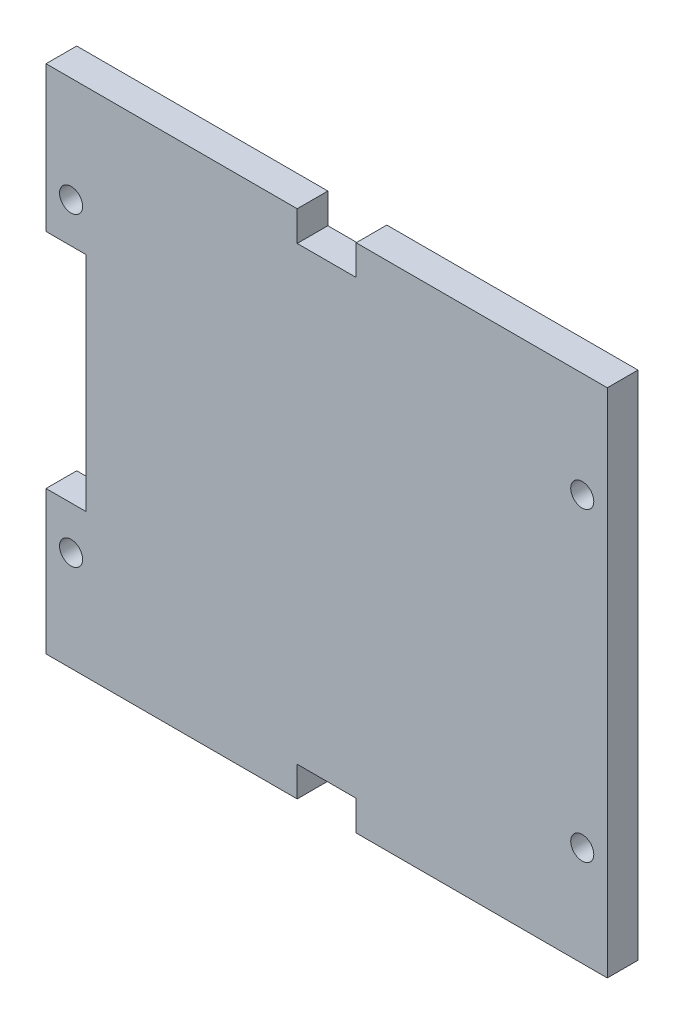
ISO-10303-21;
HEADER;
FILE_DESCRIPTION(('STEP AP214'),'2;1');
FILE_NAME('part.step','',(''),(''),'','','');
FILE_SCHEMA(('AUTOMOTIVE_DESIGN { 1 0 10303 214 1 1 1 1 }'));
ENDSEC;
DATA;
#1=APPLICATION_CONTEXT('core data for automotive mechanical design processes');
#2=APPLICATION_PROTOCOL_DEFINITION('international standard','automotive_design',2000,#1);
#3=PRODUCT_CONTEXT('',#1,'mechanical');
#4=PRODUCT('Part','Part','',(#3));
#5=PRODUCT_RELATED_PRODUCT_CATEGORY('part','',(#4));
#6=PRODUCT_DEFINITION_FORMATION('','',#4);
#7=PRODUCT_DEFINITION_CONTEXT('part definition',#1,'design');
#8=PRODUCT_DEFINITION('design','',#6,#7);
#9=PRODUCT_DEFINITION_SHAPE('','',#8);
#10=(LENGTH_UNIT() NAMED_UNIT(*) SI_UNIT(.MILLI.,.METRE.));
#11=(NAMED_UNIT(*) PLANE_ANGLE_UNIT() SI_UNIT($,.RADIAN.));
#12=(NAMED_UNIT(*) SI_UNIT($,.STERADIAN.) SOLID_ANGLE_UNIT());
#13=UNCERTAINTY_MEASURE_WITH_UNIT(LENGTH_MEASURE(1.E-05),#10,'distance_accuracy_value','');
#14=(GEOMETRIC_REPRESENTATION_CONTEXT(3) GLOBAL_UNCERTAINTY_ASSIGNED_CONTEXT((#13)) GLOBAL_UNIT_ASSIGNED_CONTEXT((#10,
#11,#12)) REPRESENTATION_CONTEXT('',''));
#15=CARTESIAN_POINT('',(0.,0.,0.));
#16=DIRECTION('',(0.,0.,1.));
#17=DIRECTION('',(1.,0.,0.));
#18=AXIS2_PLACEMENT_3D('',#15,#16,#17);
#19=CARTESIAN_POINT('',(0.,45.,3.06));
#20=DIRECTION('',(-1.,0.,0.));
#21=DIRECTION('',(0.,0.,1.));
#22=AXIS2_PLACEMENT_3D('',#19,#20,#21);
#23=PLANE('',#22);
#24=DIRECTION('',(0.,0.,1.));
#25=VECTOR('',#24,1.);
#26=CARTESIAN_POINT('',(0.,33.5,0.));
#27=LINE('',#26,#25);
#28=CARTESIAN_POINT('',(0.,33.5,0.));
#29=VERTEX_POINT('',#28);
#30=CARTESIAN_POINT('',(0.,33.5,3.06));
#31=VERTEX_POINT('',#30);
#32=EDGE_CURVE('E191',#29,#31,#27,.T.);
#33=ORIENTED_EDGE('',*,*,#32,.T.);
#34=DIRECTION('',(0.,-1.,0.));
#35=VECTOR('',#34,1.);
#36=CARTESIAN_POINT('',(0.,0.,3.06));
#37=LINE('',#36,#35);
#38=CARTESIAN_POINT('',(0.,48.,3.06));
#39=VERTEX_POINT('',#38);
#40=EDGE_CURVE('E276',#39,#31,#37,.T.);
#41=ORIENTED_EDGE('',*,*,#40,.F.);
#42=DIRECTION('',(0.,0.,-1.));
#43=VECTOR('',#42,1.);
#44=CARTESIAN_POINT('',(0.,48.,3.06));
#45=LINE('',#44,#43);
#46=CARTESIAN_POINT('',(0.,48.,0.));
#47=VERTEX_POINT('',#46);
#48=EDGE_CURVE('E253',#39,#47,#45,.T.);
#49=ORIENTED_EDGE('',*,*,#48,.T.);
#50=DIRECTION('',(0.,1.,0.));
#51=VECTOR('',#50,1.);
#52=CARTESIAN_POINT('',(0.,45.,0.));
#53=LINE('',#52,#51);
#54=EDGE_CURVE('E195',#29,#47,#53,.T.);
#55=ORIENTED_EDGE('',*,*,#54,.F.);
#56=EDGE_LOOP('',(#33,#41,#49,#55));
#57=FACE_BOUND('',#56,.T.);
#58=ADVANCED_FACE('F45',(#57),#23,.T.);
#59=CARTESIAN_POINT('',(25.06,0.,3.06));
#60=DIRECTION('',(1.,0.,0.));
#61=DIRECTION('',(0.,0.,-1.));
#62=AXIS2_PLACEMENT_3D('',#59,#60,#61);
#63=PLANE('',#62);
#64=DIRECTION('',(0.,-1.,0.));
#65=VECTOR('',#64,1.);
#66=CARTESIAN_POINT('',(25.06,0.,0.));
#67=LINE('',#66,#65);
#68=CARTESIAN_POINT('',(25.06,0.,0.));
#69=VERTEX_POINT('',#68);
#70=CARTESIAN_POINT('',(25.06,-3.,0.));
#71=VERTEX_POINT('',#70);
#72=EDGE_CURVE('E186',#69,#71,#67,.T.);
#73=ORIENTED_EDGE('',*,*,#72,.F.);
#74=DIRECTION('',(0.,0.,-1.));
#75=VECTOR('',#74,1.);
#76=CARTESIAN_POINT('',(25.06,0.,3.06));
#77=LINE('',#76,#75);
#78=CARTESIAN_POINT('',(25.06,0.,3.06));
#79=VERTEX_POINT('',#78);
#80=EDGE_CURVE('E11',#79,#69,#77,.T.);
#81=ORIENTED_EDGE('',*,*,#80,.F.);
#82=DIRECTION('',(0.,-1.,0.));
#83=VECTOR('',#82,1.);
#84=CARTESIAN_POINT('',(25.06,0.,3.06));
#85=LINE('',#84,#83);
#86=CARTESIAN_POINT('',(25.06,-3.,3.06));
#87=VERTEX_POINT('',#86);
#88=EDGE_CURVE('E231',#79,#87,#85,.T.);
#89=ORIENTED_EDGE('',*,*,#88,.T.);
#90=DIRECTION('',(0.,0.,-1.));
#91=VECTOR('',#90,1.);
#92=CARTESIAN_POINT('',(25.06,-3.,3.06));
#93=LINE('',#92,#91);
#94=EDGE_CURVE('E49',#87,#71,#93,.T.);
#95=ORIENTED_EDGE('',*,*,#94,.T.);
#96=EDGE_LOOP('',(#73,#81,#89,#95));
#97=FACE_BOUND('',#96,.T.);
#98=ADVANCED_FACE('F47',(#97),#63,.T.);
#99=CARTESIAN_POINT('',(25.06,0.,3.06));
#100=DIRECTION('',(0.,1.,0.));
#101=DIRECTION('',(-1.,0.,0.));
#102=AXIS2_PLACEMENT_3D('',#99,#100,#101);
#103=PLANE('',#102);
#104=DIRECTION('',(1.,0.,0.));
#105=VECTOR('',#104,1.);
#106=CARTESIAN_POINT('',(25.06,0.,0.));
#107=LINE('',#106,#105);
#108=CARTESIAN_POINT('',(30.94,0.,0.));
#109=VERTEX_POINT('',#108);
#110=EDGE_CURVE('E229',#69,#109,#107,.T.);
#111=ORIENTED_EDGE('',*,*,#110,.T.);
#112=DIRECTION('',(0.,0.,-1.));
#113=VECTOR('',#112,1.);
#114=CARTESIAN_POINT('',(30.94,0.,3.06));
#115=LINE('',#114,#113);
#116=CARTESIAN_POINT('',(30.94,0.,3.06));
#117=VERTEX_POINT('',#116);
#118=EDGE_CURVE('E55',#117,#109,#115,.T.);
#119=ORIENTED_EDGE('',*,*,#118,.F.);
#120=DIRECTION('',(1.,0.,0.));
#121=VECTOR('',#120,1.);
#122=CARTESIAN_POINT('',(25.06,0.,3.06));
#123=LINE('',#122,#121);
#124=EDGE_CURVE('E157',#79,#117,#123,.T.);
#125=ORIENTED_EDGE('',*,*,#124,.F.);
#126=ORIENTED_EDGE('',*,*,#80,.T.);
#127=EDGE_LOOP('',(#111,#119,#125,#126));
#128=FACE_BOUND('',#127,.T.);
#129=ADVANCED_FACE('F266',(#128),#103,.F.);
#130=CARTESIAN_POINT('',(30.94,0.,3.06));
#131=DIRECTION('',(1.,0.,0.));
#132=DIRECTION('',(0.,0.,-1.));
#133=AXIS2_PLACEMENT_3D('',#130,#131,#132);
#134=PLANE('',#133);
#135=DIRECTION('',(0.,-1.,0.));
#136=VECTOR('',#135,1.);
#137=CARTESIAN_POINT('',(30.94,0.,0.));
#138=LINE('',#137,#136);
#139=CARTESIAN_POINT('',(30.94,-3.,0.));
#140=VERTEX_POINT('',#139);
#141=EDGE_CURVE('E167',#109,#140,#138,.T.);
#142=ORIENTED_EDGE('',*,*,#141,.T.);
#143=DIRECTION('',(0.,0.,-1.));
#144=VECTOR('',#143,1.);
#145=CARTESIAN_POINT('',(30.94,-3.,3.06));
#146=LINE('',#145,#144);
#147=CARTESIAN_POINT('',(30.94,-3.,3.06));
#148=VERTEX_POINT('',#147);
#149=EDGE_CURVE('E164',#148,#140,#146,.T.);
#150=ORIENTED_EDGE('',*,*,#149,.F.);
#151=DIRECTION('',(0.,-1.,0.));
#152=VECTOR('',#151,1.);
#153=CARTESIAN_POINT('',(30.94,0.,3.06));
#154=LINE('',#153,#152);
#155=EDGE_CURVE('E151',#117,#148,#154,.T.);
#156=ORIENTED_EDGE('',*,*,#155,.F.);
#157=ORIENTED_EDGE('',*,*,#118,.T.);
#158=EDGE_LOOP('',(#142,#150,#156,#157));
#159=FACE_BOUND('',#158,.T.);
#160=ADVANCED_FACE('F165',(#159),#134,.F.);
#161=CARTESIAN_POINT('',(56.,-3.,3.06));
#162=DIRECTION('',(0.,-1.,0.));
#163=DIRECTION('',(1.,0.,0.));
#164=AXIS2_PLACEMENT_3D('',#161,#162,#163);
#165=PLANE('',#164);
#166=DIRECTION('',(-1.,0.,0.));
#167=VECTOR('',#166,1.);
#168=CARTESIAN_POINT('',(56.,-3.,0.));
#169=LINE('',#168,#167);
#170=CARTESIAN_POINT('',(56.,-3.,0.));
#171=VERTEX_POINT('',#170);
#172=EDGE_CURVE('E224',#171,#140,#169,.T.);
#173=ORIENTED_EDGE('',*,*,#172,.F.);
#174=DIRECTION('',(0.,0.,-1.));
#175=VECTOR('',#174,1.);
#176=CARTESIAN_POINT('',(56.,-3.,3.06));
#177=LINE('',#176,#175);
#178=CARTESIAN_POINT('',(56.,-3.,3.06));
#179=VERTEX_POINT('',#178);
#180=EDGE_CURVE('E172',#179,#171,#177,.T.);
#181=ORIENTED_EDGE('',*,*,#180,.F.);
#182=DIRECTION('',(-1.,0.,0.));
#183=VECTOR('',#182,1.);
#184=CARTESIAN_POINT('',(56.,-3.,3.06));
#185=LINE('',#184,#183);
#186=EDGE_CURVE('E156',#179,#148,#185,.T.);
#187=ORIENTED_EDGE('',*,*,#186,.T.);
#188=ORIENTED_EDGE('',*,*,#149,.T.);
#189=EDGE_LOOP('',(#173,#181,#187,#188));
#190=FACE_BOUND('',#189,.T.);
#191=ADVANCED_FACE('F175',(#190),#165,.T.);
#192=CARTESIAN_POINT('',(56.,0.,3.06));
#193=DIRECTION('',(1.,0.,0.));
#194=DIRECTION('',(0.,0.,-1.));
#195=AXIS2_PLACEMENT_3D('',#192,#193,#194);
#196=PLANE('',#195);
#197=DIRECTION('',(0.,-1.,0.));
#198=VECTOR('',#197,1.);
#199=CARTESIAN_POINT('',(56.,0.,0.));
#200=LINE('',#199,#198);
#201=CARTESIAN_POINT('',(56.,48.,0.));
#202=VERTEX_POINT('',#201);
#203=EDGE_CURVE('E220',#202,#171,#200,.T.);
#204=ORIENTED_EDGE('',*,*,#203,.F.);
#205=DIRECTION('',(0.,0.,-1.));
#206=VECTOR('',#205,1.);
#207=CARTESIAN_POINT('',(56.,48.,3.06));
#208=LINE('',#207,#206);
#209=CARTESIAN_POINT('',(56.,48.,3.06));
#210=VERTEX_POINT('',#209);
#211=EDGE_CURVE('E237',#210,#202,#208,.T.);
#212=ORIENTED_EDGE('',*,*,#211,.F.);
#213=DIRECTION('',(0.,1.,0.));
#214=VECTOR('',#213,1.);
#215=CARTESIAN_POINT('',(56.,45.,3.06));
#216=LINE('',#215,#214);
#217=EDGE_CURVE('E177',#179,#210,#216,.T.);
#218=ORIENTED_EDGE('',*,*,#217,.F.);
#219=ORIENTED_EDGE('',*,*,#180,.T.);
#220=EDGE_LOOP('',(#204,#212,#218,#219));
#221=FACE_BOUND('',#220,.T.);
#222=ADVANCED_FACE('F406',(#221),#196,.T.);
#223=CARTESIAN_POINT('',(56.,48.,3.06));
#224=DIRECTION('',(0.,-1.,0.));
#225=DIRECTION('',(0.,0.,-1.));
#226=AXIS2_PLACEMENT_3D('',#223,#224,#225);
#227=PLANE('',#226);
#228=DIRECTION('',(-1.,0.,0.));
#229=VECTOR('',#228,1.);
#230=CARTESIAN_POINT('',(56.,48.,0.));
#231=LINE('',#230,#229);
#232=CARTESIAN_POINT('',(30.94,48.,0.));
#233=VERTEX_POINT('',#232);
#234=EDGE_CURVE('E216',#202,#233,#231,.T.);
#235=ORIENTED_EDGE('',*,*,#234,.T.);
#236=DIRECTION('',(0.,0.,-1.));
#237=VECTOR('',#236,1.);
#238=CARTESIAN_POINT('',(30.94,48.,3.06));
#239=LINE('',#238,#237);
#240=CARTESIAN_POINT('',(30.94,48.,3.06));
#241=VERTEX_POINT('',#240);
#242=EDGE_CURVE('E241',#241,#233,#239,.T.);
#243=ORIENTED_EDGE('',*,*,#242,.F.);
#244=DIRECTION('',(-1.,0.,0.));
#245=VECTOR('',#244,1.);
#246=CARTESIAN_POINT('',(56.,48.,3.06));
#247=LINE('',#246,#245);
#248=EDGE_CURVE('E180',#210,#241,#247,.T.);
#249=ORIENTED_EDGE('',*,*,#248,.F.);
#250=ORIENTED_EDGE('',*,*,#211,.T.);
#251=EDGE_LOOP('',(#235,#243,#249,#250));
#252=FACE_BOUND('',#251,.T.);
#253=ADVANCED_FACE('F301',(#252),#227,.F.);
#254=CARTESIAN_POINT('',(30.94,45.,3.06));
#255=DIRECTION('',(-1.,0.,0.));
#256=DIRECTION('',(0.,-1.,0.));
#257=AXIS2_PLACEMENT_3D('',#254,#255,#256);
#258=PLANE('',#257);
#259=DIRECTION('',(0.,1.,0.));
#260=VECTOR('',#259,1.);
#261=CARTESIAN_POINT('',(30.94,45.,0.));
#262=LINE('',#261,#260);
#263=CARTESIAN_POINT('',(30.94,45.,0.));
#264=VERTEX_POINT('',#263);
#265=EDGE_CURVE('E212',#264,#233,#262,.T.);
#266=ORIENTED_EDGE('',*,*,#265,.F.);
#267=DIRECTION('',(0.,0.,-1.));
#268=VECTOR('',#267,1.);
#269=CARTESIAN_POINT('',(30.94,45.,3.06));
#270=LINE('',#269,#268);
#271=CARTESIAN_POINT('',(30.94,45.,3.06));
#272=VERTEX_POINT('',#271);
#273=EDGE_CURVE('E244',#272,#264,#270,.T.);
#274=ORIENTED_EDGE('',*,*,#273,.F.);
#275=DIRECTION('',(0.,1.,0.));
#276=VECTOR('',#275,1.);
#277=CARTESIAN_POINT('',(30.94,45.,3.06));
#278=LINE('',#277,#276);
#279=EDGE_CURVE('E291',#272,#241,#278,.T.);
#280=ORIENTED_EDGE('',*,*,#279,.T.);
#281=ORIENTED_EDGE('',*,*,#242,.T.);
#282=EDGE_LOOP('',(#266,#274,#280,#281));
#283=FACE_BOUND('',#282,.T.);
#284=ADVANCED_FACE('F305',(#283),#258,.T.);
#285=CARTESIAN_POINT('',(25.06,45.,3.06));
#286=DIRECTION('',(0.,1.,0.));
#287=DIRECTION('',(0.,0.,1.));
#288=AXIS2_PLACEMENT_3D('',#285,#286,#287);
#289=PLANE('',#288);
#290=DIRECTION('',(1.,0.,0.));
#291=VECTOR('',#290,1.);
#292=CARTESIAN_POINT('',(25.06,45.,0.));
#293=LINE('',#292,#291);
#294=CARTESIAN_POINT('',(25.06,45.,0.));
#295=VERTEX_POINT('',#294);
#296=EDGE_CURVE('E208',#295,#264,#293,.T.);
#297=ORIENTED_EDGE('',*,*,#296,.F.);
#298=DIRECTION('',(0.,0.,-1.));
#299=VECTOR('',#298,1.);
#300=CARTESIAN_POINT('',(25.06,45.,3.06));
#301=LINE('',#300,#299);
#302=CARTESIAN_POINT('',(25.06,45.,3.06));
#303=VERTEX_POINT('',#302);
#304=EDGE_CURVE('E247',#303,#295,#301,.T.);
#305=ORIENTED_EDGE('',*,*,#304,.F.);
#306=DIRECTION('',(1.,0.,0.));
#307=VECTOR('',#306,1.);
#308=CARTESIAN_POINT('',(25.06,45.,3.06));
#309=LINE('',#308,#307);
#310=EDGE_CURVE('E287',#303,#272,#309,.T.);
#311=ORIENTED_EDGE('',*,*,#310,.T.);
#312=ORIENTED_EDGE('',*,*,#273,.T.);
#313=EDGE_LOOP('',(#297,#305,#311,#312));
#314=FACE_BOUND('',#313,.T.);
#315=ADVANCED_FACE('F308',(#314),#289,.T.);
#316=CARTESIAN_POINT('',(25.06,45.,3.06));
#317=DIRECTION('',(-1.,0.,0.));
#318=DIRECTION('',(0.,0.,1.));
#319=AXIS2_PLACEMENT_3D('',#316,#317,#318);
#320=PLANE('',#319);
#321=DIRECTION('',(0.,1.,0.));
#322=VECTOR('',#321,1.);
#323=CARTESIAN_POINT('',(25.06,45.,0.));
#324=LINE('',#323,#322);
#325=CARTESIAN_POINT('',(25.06,48.,0.));
#326=VERTEX_POINT('',#325);
#327=EDGE_CURVE('E204',#295,#326,#324,.T.);
#328=ORIENTED_EDGE('',*,*,#327,.T.);
#329=DIRECTION('',(0.,0.,-1.));
#330=VECTOR('',#329,1.);
#331=CARTESIAN_POINT('',(25.06,48.,3.06));
#332=LINE('',#331,#330);
#333=CARTESIAN_POINT('',(25.06,48.,3.06));
#334=VERTEX_POINT('',#333);
#335=EDGE_CURVE('E250',#334,#326,#332,.T.);
#336=ORIENTED_EDGE('',*,*,#335,.F.);
#337=DIRECTION('',(0.,1.,0.));
#338=VECTOR('',#337,1.);
#339=CARTESIAN_POINT('',(25.06,45.,3.06));
#340=LINE('',#339,#338);
#341=EDGE_CURVE('E284',#303,#334,#340,.T.);
#342=ORIENTED_EDGE('',*,*,#341,.F.);
#343=ORIENTED_EDGE('',*,*,#304,.T.);
#344=EDGE_LOOP('',(#328,#336,#342,#343));
#345=FACE_BOUND('',#344,.T.);
#346=ADVANCED_FACE('F313',(#345),#320,.F.);
#347=CARTESIAN_POINT('',(0.,48.,3.06));
#348=DIRECTION('',(0.,1.,0.));
#349=DIRECTION('',(0.,0.,1.));
#350=AXIS2_PLACEMENT_3D('',#347,#348,#349);
#351=PLANE('',#350);
#352=DIRECTION('',(1.,0.,0.));
#353=VECTOR('',#352,1.);
#354=CARTESIAN_POINT('',(0.,48.,0.));
#355=LINE('',#354,#353);
#356=EDGE_CURVE('E200',#47,#326,#355,.T.);
#357=ORIENTED_EDGE('',*,*,#356,.F.);
#358=ORIENTED_EDGE('',*,*,#48,.F.);
#359=DIRECTION('',(1.,0.,0.));
#360=VECTOR('',#359,1.);
#361=CARTESIAN_POINT('',(0.,48.,3.06));
#362=LINE('',#361,#360);
#363=EDGE_CURVE('E280',#39,#334,#362,.T.);
#364=ORIENTED_EDGE('',*,*,#363,.T.);
#365=ORIENTED_EDGE('',*,*,#335,.T.);
#366=EDGE_LOOP('',(#357,#358,#364,#365));
#367=FACE_BOUND('',#366,.T.);
#368=ADVANCED_FACE('F318',(#367),#351,.T.);
#369=DIRECTION('',(0.,0.,1.));
#370=VECTOR('',#369,1.);
#371=CARTESIAN_POINT('',(0.,11.2981330221704,0.));
#372=LINE('',#371,#370);
#373=CARTESIAN_POINT('',(0.,11.2981330221704,0.));
#374=VERTEX_POINT('',#373);
#375=CARTESIAN_POINT('',(0.,11.2981330221704,3.06));
#376=VERTEX_POINT('',#375);
#377=EDGE_CURVE('E273',#374,#376,#372,.T.);
#378=ORIENTED_EDGE('',*,*,#377,.F.);
#379=CARTESIAN_POINT('',(0.,-3.,0.));
#380=VERTEX_POINT('',#379);
#381=EDGE_CURVE('E196',#380,#374,#53,.T.);
#382=ORIENTED_EDGE('',*,*,#381,.F.);
#383=DIRECTION('',(0.,0.,-1.));
#384=VECTOR('',#383,1.);
#385=CARTESIAN_POINT('',(0.,-3.,3.06));
#386=LINE('',#385,#384);
#387=CARTESIAN_POINT('',(0.,-3.,3.06));
#388=VERTEX_POINT('',#387);
#389=EDGE_CURVE('E256',#388,#380,#386,.T.);
#390=ORIENTED_EDGE('',*,*,#389,.F.);
#391=EDGE_CURVE('E270',#376,#388,#37,.T.);
#392=ORIENTED_EDGE('',*,*,#391,.F.);
#393=EDGE_LOOP('',(#378,#382,#390,#392));
#394=FACE_BOUND('',#393,.T.);
#395=ADVANCED_FACE('F379',(#394),#23,.T.);
#396=CARTESIAN_POINT('',(0.,-3.,3.06));
#397=DIRECTION('',(0.,1.,0.));
#398=DIRECTION('',(0.,0.,1.));
#399=AXIS2_PLACEMENT_3D('',#396,#397,#398);
#400=PLANE('',#399);
#401=DIRECTION('',(1.,0.,0.));
#402=VECTOR('',#401,1.);
#403=CARTESIAN_POINT('',(0.,-3.,0.));
#404=LINE('',#403,#402);
#405=EDGE_CURVE('E190',#380,#71,#404,.T.);
#406=ORIENTED_EDGE('',*,*,#405,.T.);
#407=ORIENTED_EDGE('',*,*,#94,.F.);
#408=DIRECTION('',(1.,0.,0.));
#409=VECTOR('',#408,1.);
#410=CARTESIAN_POINT('',(0.,-3.,3.06));
#411=LINE('',#410,#409);
#412=EDGE_CURVE('E121',#388,#87,#411,.T.);
#413=ORIENTED_EDGE('',*,*,#412,.F.);
#414=ORIENTED_EDGE('',*,*,#389,.T.);
#415=EDGE_LOOP('',(#406,#407,#413,#414));
#416=FACE_BOUND('',#415,.T.);
#417=ADVANCED_FACE('F263',(#416),#400,.F.);
#418=CARTESIAN_POINT('',(0.,0.,3.06));
#419=DIRECTION('',(0.,0.,1.));
#420=DIRECTION('',(1.,0.,0.));
#421=AXIS2_PLACEMENT_3D('',#418,#419,#420);
#422=PLANE('',#421);
#423=CARTESIAN_POINT('',(2.50000000000003,7.,3.06));
#424=DIRECTION('',(0.,0.,1.));
#425=DIRECTION('',(1.,0.,0.));
#426=AXIS2_PLACEMENT_3D('',#423,#424,#425);
#427=CIRCLE('',#426,1.15);
#428=CARTESIAN_POINT('',(3.65000000000003,7.,3.06));
#429=VERTEX_POINT('',#428);
#430=EDGE_CURVE('E535',#429,#429,#427,.T.);
#431=ORIENTED_EDGE('',*,*,#430,.F.);
#432=EDGE_LOOP('',(#431));
#433=FACE_BOUND('',#432,.T.);
#434=CARTESIAN_POINT('',(53.5,7.,3.06));
#435=DIRECTION('',(0.,0.,1.));
#436=DIRECTION('',(1.,0.,0.));
#437=AXIS2_PLACEMENT_3D('',#434,#435,#436);
#438=CIRCLE('',#437,1.15);
#439=CARTESIAN_POINT('',(54.65,7.,3.06));
#440=VERTEX_POINT('',#439);
#441=EDGE_CURVE('E542',#440,#440,#438,.T.);
#442=ORIENTED_EDGE('',*,*,#441,.F.);
#443=EDGE_LOOP('',(#442));
#444=FACE_BOUND('',#443,.T.);
#445=CARTESIAN_POINT('',(53.5,37.5,3.06));
#446=DIRECTION('',(0.,0.,1.));
#447=DIRECTION('',(1.,0.,0.));
#448=AXIS2_PLACEMENT_3D('',#445,#446,#447);
#449=CIRCLE('',#448,1.15);
#450=CARTESIAN_POINT('',(54.65,37.5,3.06));
#451=VERTEX_POINT('',#450);
#452=EDGE_CURVE('E552',#451,#451,#449,.T.);
#453=ORIENTED_EDGE('',*,*,#452,.F.);
#454=EDGE_LOOP('',(#453));
#455=FACE_BOUND('',#454,.T.);
#456=CARTESIAN_POINT('',(2.50000000000002,37.5,3.06));
#457=DIRECTION('',(0.,0.,1.));
#458=DIRECTION('',(1.,0.,0.));
#459=AXIS2_PLACEMENT_3D('',#456,#457,#458);
#460=CIRCLE('',#459,1.15);
#461=CARTESIAN_POINT('',(3.65000000000002,37.5,3.06));
#462=VERTEX_POINT('',#461);
#463=EDGE_CURVE('E365',#462,#462,#460,.T.);
#464=ORIENTED_EDGE('',*,*,#463,.F.);
#465=EDGE_LOOP('',(#464));
#466=FACE_BOUND('',#465,.T.);
#467=DIRECTION('',(-1.,0.,0.));
#468=VECTOR('',#467,1.);
#469=CARTESIAN_POINT('',(0.,33.5,3.06));
#470=LINE('',#469,#468);
#471=CARTESIAN_POINT('',(4.,33.5,3.06));
#472=VERTEX_POINT('',#471);
#473=EDGE_CURVE('E326',#472,#31,#470,.T.);
#474=ORIENTED_EDGE('',*,*,#473,.F.);
#475=DIRECTION('',(0.,1.,0.));
#476=VECTOR('',#475,1.);
#477=CARTESIAN_POINT('',(4.,33.5,3.06));
#478=LINE('',#477,#476);
#479=CARTESIAN_POINT('',(4.,11.2981330221704,3.06));
#480=VERTEX_POINT('',#479);
#481=EDGE_CURVE('E344',#480,#472,#478,.T.);
#482=ORIENTED_EDGE('',*,*,#481,.F.);
#483=DIRECTION('',(1.,0.,0.));
#484=VECTOR('',#483,1.);
#485=CARTESIAN_POINT('',(0.,11.2981330221704,3.06));
#486=LINE('',#485,#484);
#487=EDGE_CURVE('E361',#376,#480,#486,.T.);
#488=ORIENTED_EDGE('',*,*,#487,.F.);
#489=ORIENTED_EDGE('',*,*,#391,.T.);
#490=ORIENTED_EDGE('',*,*,#412,.T.);
#491=ORIENTED_EDGE('',*,*,#88,.F.);
#492=ORIENTED_EDGE('',*,*,#124,.T.);
#493=ORIENTED_EDGE('',*,*,#155,.T.);
#494=ORIENTED_EDGE('',*,*,#186,.F.);
#495=ORIENTED_EDGE('',*,*,#217,.T.);
#496=ORIENTED_EDGE('',*,*,#248,.T.);
#497=ORIENTED_EDGE('',*,*,#279,.F.);
#498=ORIENTED_EDGE('',*,*,#310,.F.);
#499=ORIENTED_EDGE('',*,*,#341,.T.);
#500=ORIENTED_EDGE('',*,*,#363,.F.);
#501=ORIENTED_EDGE('',*,*,#40,.T.);
#502=EDGE_LOOP('',(#474,#482,#488,#489,#490,#491,#492,#493,#494,#495,#496,#497,#498,#499,#500,#501));
#503=FACE_BOUND('',#502,.T.);
#504=ADVANCED_FACE('F154',(#433,#444,#455,#466,#503),#422,.T.);
#505=CARTESIAN_POINT('',(0.,0.,0.));
#506=DIRECTION('',(0.,0.,1.));
#507=DIRECTION('',(1.,0.,0.));
#508=AXIS2_PLACEMENT_3D('',#505,#506,#507);
#509=PLANE('',#508);
#510=CARTESIAN_POINT('',(2.50000000000003,7.,0.));
#511=DIRECTION('',(0.,0.,1.));
#512=DIRECTION('',(1.,0.,0.));
#513=AXIS2_PLACEMENT_3D('',#510,#511,#512);
#514=CIRCLE('',#513,1.15);
#515=CARTESIAN_POINT('',(3.65000000000003,7.,0.));
#516=VERTEX_POINT('',#515);
#517=EDGE_CURVE('E532',#516,#516,#514,.T.);
#518=ORIENTED_EDGE('',*,*,#517,.T.);
#519=EDGE_LOOP('',(#518));
#520=FACE_BOUND('',#519,.T.);
#521=CARTESIAN_POINT('',(53.5,7.,0.));
#522=DIRECTION('',(0.,0.,1.));
#523=DIRECTION('',(1.,0.,0.));
#524=AXIS2_PLACEMENT_3D('',#521,#522,#523);
#525=CIRCLE('',#524,1.15);
#526=CARTESIAN_POINT('',(54.65,7.,0.));
#527=VERTEX_POINT('',#526);
#528=EDGE_CURVE('E537',#527,#527,#525,.T.);
#529=ORIENTED_EDGE('',*,*,#528,.T.);
#530=EDGE_LOOP('',(#529));
#531=FACE_BOUND('',#530,.T.);
#532=CARTESIAN_POINT('',(53.5,37.5,0.));
#533=DIRECTION('',(0.,0.,1.));
#534=DIRECTION('',(1.,0.,0.));
#535=AXIS2_PLACEMENT_3D('',#532,#533,#534);
#536=CIRCLE('',#535,1.15);
#537=CARTESIAN_POINT('',(54.65,37.5,0.));
#538=VERTEX_POINT('',#537);
#539=EDGE_CURVE('E548',#538,#538,#536,.T.);
#540=ORIENTED_EDGE('',*,*,#539,.T.);
#541=EDGE_LOOP('',(#540));
#542=FACE_BOUND('',#541,.T.);
#543=CARTESIAN_POINT('',(2.50000000000002,37.5,0.));
#544=DIRECTION('',(0.,0.,1.));
#545=DIRECTION('',(1.,0.,0.));
#546=AXIS2_PLACEMENT_3D('',#543,#544,#545);
#547=CIRCLE('',#546,1.15);
#548=CARTESIAN_POINT('',(3.65000000000002,37.5,0.));
#549=VERTEX_POINT('',#548);
#550=EDGE_CURVE('E556',#549,#549,#547,.T.);
#551=ORIENTED_EDGE('',*,*,#550,.T.);
#552=EDGE_LOOP('',(#551));
#553=FACE_BOUND('',#552,.T.);
#554=DIRECTION('',(0.,1.,0.));
#555=VECTOR('',#554,1.);
#556=CARTESIAN_POINT('',(4.,33.5,0.));
#557=LINE('',#556,#555);
#558=CARTESIAN_POINT('',(4.,11.2981330221704,0.));
#559=VERTEX_POINT('',#558);
#560=CARTESIAN_POINT('',(4.,33.5,0.));
#561=VERTEX_POINT('',#560);
#562=EDGE_CURVE('E63',#559,#561,#557,.T.);
#563=ORIENTED_EDGE('',*,*,#562,.T.);
#564=DIRECTION('',(-1.,0.,0.));
#565=VECTOR('',#564,1.);
#566=CARTESIAN_POINT('',(0.,33.5,0.));
#567=LINE('',#566,#565);
#568=EDGE_CURVE('E349',#561,#29,#567,.T.);
#569=ORIENTED_EDGE('',*,*,#568,.T.);
#570=ORIENTED_EDGE('',*,*,#54,.T.);
#571=ORIENTED_EDGE('',*,*,#356,.T.);
#572=ORIENTED_EDGE('',*,*,#327,.F.);
#573=ORIENTED_EDGE('',*,*,#296,.T.);
#574=ORIENTED_EDGE('',*,*,#265,.T.);
#575=ORIENTED_EDGE('',*,*,#234,.F.);
#576=ORIENTED_EDGE('',*,*,#203,.T.);
#577=ORIENTED_EDGE('',*,*,#172,.T.);
#578=ORIENTED_EDGE('',*,*,#141,.F.);
#579=ORIENTED_EDGE('',*,*,#110,.F.);
#580=ORIENTED_EDGE('',*,*,#72,.T.);
#581=ORIENTED_EDGE('',*,*,#405,.F.);
#582=ORIENTED_EDGE('',*,*,#381,.T.);
#583=DIRECTION('',(1.,0.,0.));
#584=VECTOR('',#583,1.);
#585=CARTESIAN_POINT('',(0.,11.2981330221704,0.));
#586=LINE('',#585,#584);
#587=EDGE_CURVE('E354',#374,#559,#586,.T.);
#588=ORIENTED_EDGE('',*,*,#587,.T.);
#589=EDGE_LOOP('',(#563,#569,#570,#571,#572,#573,#574,#575,#576,#577,#578,#579,#580,#581,#582,#588));
#590=FACE_BOUND('',#589,.T.);
#591=ADVANCED_FACE('F265',(#520,#531,#542,#553,#590),#509,.F.);
#592=CARTESIAN_POINT('',(0.,33.5,0.));
#593=DIRECTION('',(0.,1.,0.));
#594=DIRECTION('',(0.,0.,1.));
#595=AXIS2_PLACEMENT_3D('',#592,#593,#594);
#596=PLANE('',#595);
#597=ORIENTED_EDGE('',*,*,#473,.T.);
#598=ORIENTED_EDGE('',*,*,#32,.F.);
#599=ORIENTED_EDGE('',*,*,#568,.F.);
#600=DIRECTION('',(0.,0.,1.));
#601=VECTOR('',#600,1.);
#602=CARTESIAN_POINT('',(4.,33.5,0.));
#603=LINE('',#602,#601);
#604=EDGE_CURVE('E335',#561,#472,#603,.T.);
#605=ORIENTED_EDGE('',*,*,#604,.T.);
#606=EDGE_LOOP('',(#597,#598,#599,#605));
#607=FACE_BOUND('',#606,.T.);
#608=ADVANCED_FACE('F350',(#607),#596,.F.);
#609=CARTESIAN_POINT('',(4.,33.5,0.));
#610=DIRECTION('',(1.,0.,0.));
#611=DIRECTION('',(0.,1.,0.));
#612=AXIS2_PLACEMENT_3D('',#609,#610,#611);
#613=PLANE('',#612);
#614=ORIENTED_EDGE('',*,*,#481,.T.);
#615=ORIENTED_EDGE('',*,*,#604,.F.);
#616=ORIENTED_EDGE('',*,*,#562,.F.);
#617=DIRECTION('',(0.,0.,1.));
#618=VECTOR('',#617,1.);
#619=CARTESIAN_POINT('',(4.,11.2981330221704,0.));
#620=LINE('',#619,#618);
#621=EDGE_CURVE('E346',#559,#480,#620,.T.);
#622=ORIENTED_EDGE('',*,*,#621,.T.);
#623=EDGE_LOOP('',(#614,#615,#616,#622));
#624=FACE_BOUND('',#623,.T.);
#625=ADVANCED_FACE('F343',(#624),#613,.F.);
#626=CARTESIAN_POINT('',(0.,11.2981330221704,0.));
#627=DIRECTION('',(0.,-1.,0.));
#628=DIRECTION('',(0.,0.,-1.));
#629=AXIS2_PLACEMENT_3D('',#626,#627,#628);
#630=PLANE('',#629);
#631=ORIENTED_EDGE('',*,*,#487,.T.);
#632=ORIENTED_EDGE('',*,*,#621,.F.);
#633=ORIENTED_EDGE('',*,*,#587,.F.);
#634=ORIENTED_EDGE('',*,*,#377,.T.);
#635=EDGE_LOOP('',(#631,#632,#633,#634));
#636=FACE_BOUND('',#635,.T.);
#637=ADVANCED_FACE('F376',(#636),#630,.F.);
#638=CARTESIAN_POINT('',(2.50000000000002,37.5,0.));
#639=DIRECTION('',(0.,0.,1.));
#640=DIRECTION('',(1.,0.,0.));
#641=AXIS2_PLACEMENT_3D('',#638,#639,#640);
#642=CYLINDRICAL_SURFACE('',#641,1.15);
#643=ORIENTED_EDGE('',*,*,#550,.F.);
#644=EDGE_LOOP('',(#643));
#645=FACE_BOUND('',#644,.T.);
#646=ORIENTED_EDGE('',*,*,#463,.T.);
#647=EDGE_LOOP('',(#646));
#648=FACE_BOUND('',#647,.T.);
#649=ADVANCED_FACE('F487',(#645,#648),#642,.F.);
#650=CARTESIAN_POINT('',(53.5,37.5,0.));
#651=DIRECTION('',(0.,0.,1.));
#652=DIRECTION('',(1.,0.,0.));
#653=AXIS2_PLACEMENT_3D('',#650,#651,#652);
#654=CYLINDRICAL_SURFACE('',#653,1.15);
#655=ORIENTED_EDGE('',*,*,#539,.F.);
#656=EDGE_LOOP('',(#655));
#657=FACE_BOUND('',#656,.T.);
#658=ORIENTED_EDGE('',*,*,#452,.T.);
#659=EDGE_LOOP('',(#658));
#660=FACE_BOUND('',#659,.T.);
#661=ADVANCED_FACE('F496',(#657,#660),#654,.F.);
#662=CARTESIAN_POINT('',(53.5,7.,0.));
#663=DIRECTION('',(0.,0.,1.));
#664=DIRECTION('',(1.,0.,0.));
#665=AXIS2_PLACEMENT_3D('',#662,#663,#664);
#666=CYLINDRICAL_SURFACE('',#665,1.15);
#667=ORIENTED_EDGE('',*,*,#528,.F.);
#668=EDGE_LOOP('',(#667));
#669=FACE_BOUND('',#668,.T.);
#670=ORIENTED_EDGE('',*,*,#441,.T.);
#671=EDGE_LOOP('',(#670));
#672=FACE_BOUND('',#671,.T.);
#673=ADVANCED_FACE('F506',(#669,#672),#666,.F.);
#674=CARTESIAN_POINT('',(2.50000000000003,7.,0.));
#675=DIRECTION('',(0.,0.,1.));
#676=DIRECTION('',(1.,0.,0.));
#677=AXIS2_PLACEMENT_3D('',#674,#675,#676);
#678=CYLINDRICAL_SURFACE('',#677,1.15);
#679=ORIENTED_EDGE('',*,*,#517,.F.);
#680=EDGE_LOOP('',(#679));
#681=FACE_BOUND('',#680,.T.);
#682=ORIENTED_EDGE('',*,*,#430,.T.);
#683=EDGE_LOOP('',(#682));
#684=FACE_BOUND('',#683,.T.);
#685=ADVANCED_FACE('F516',(#681,#684),#678,.F.);
#686=CLOSED_SHELL('',(#58,#98,#129,#160,#191,#222,#253,#284,#315,#346,#368,#395,#417,#504,#591,
#608,#625,#637,#649,#661,#673,#685));
#687=MANIFOLD_SOLID_BREP('B2',#686);
#688=ADVANCED_BREP_SHAPE_REPRESENTATION('',(#18,#687),#14);
#689=SHAPE_DEFINITION_REPRESENTATION(#9,#688);
ENDSEC;
END-ISO-10303-21;
